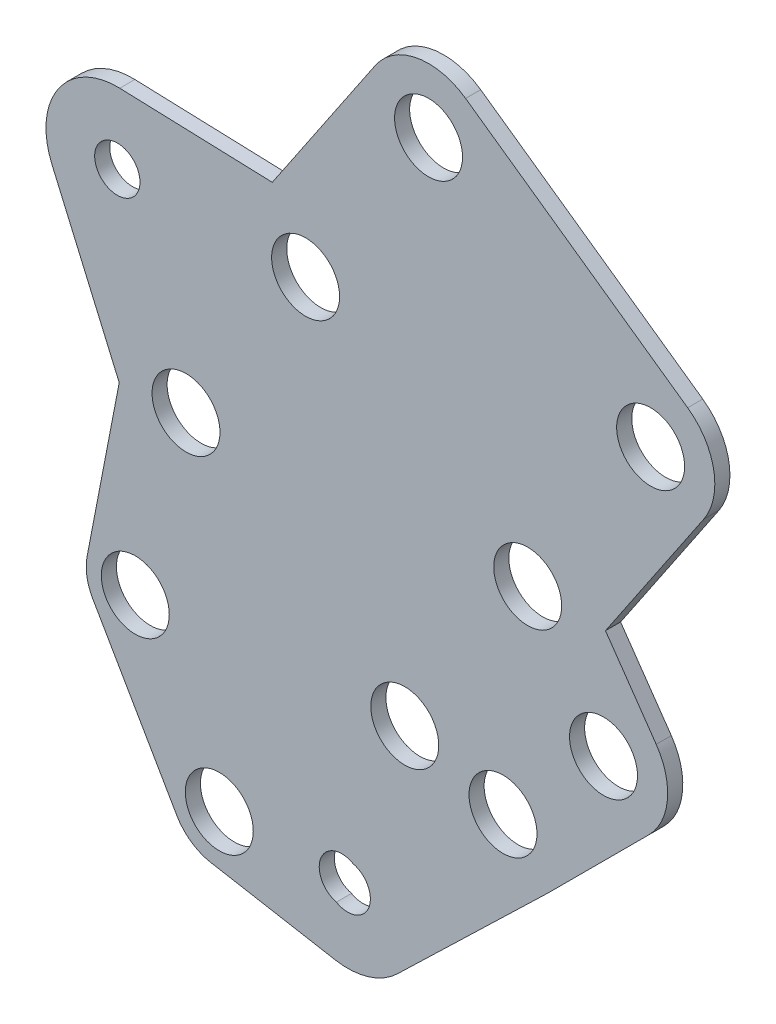
ISO-10303-21;
HEADER;
FILE_DESCRIPTION(('STEP AP214'),'2;1');
FILE_NAME('part.step','',(''),(''),'','','');
FILE_SCHEMA(('AUTOMOTIVE_DESIGN { 1 0 10303 214 1 1 1 1 }'));
ENDSEC;
DATA;
#1=APPLICATION_CONTEXT('core data for automotive mechanical design processes');
#2=APPLICATION_PROTOCOL_DEFINITION('international standard','automotive_design',2000,#1);
#3=PRODUCT_CONTEXT('',#1,'mechanical');
#4=PRODUCT('Part','Part','',(#3));
#5=PRODUCT_RELATED_PRODUCT_CATEGORY('part','',(#4));
#6=PRODUCT_DEFINITION_FORMATION('','',#4);
#7=PRODUCT_DEFINITION_CONTEXT('part definition',#1,'design');
#8=PRODUCT_DEFINITION('design','',#6,#7);
#9=PRODUCT_DEFINITION_SHAPE('','',#8);
#10=(LENGTH_UNIT() NAMED_UNIT(*) SI_UNIT(.MILLI.,.METRE.));
#11=(NAMED_UNIT(*) PLANE_ANGLE_UNIT() SI_UNIT($,.RADIAN.));
#12=(NAMED_UNIT(*) SI_UNIT($,.STERADIAN.) SOLID_ANGLE_UNIT());
#13=UNCERTAINTY_MEASURE_WITH_UNIT(LENGTH_MEASURE(1.E-05),#10,'distance_accuracy_value','');
#14=(GEOMETRIC_REPRESENTATION_CONTEXT(3) GLOBAL_UNCERTAINTY_ASSIGNED_CONTEXT((#13)) GLOBAL_UNIT_ASSIGNED_CONTEXT((#10,
#11,#12)) REPRESENTATION_CONTEXT('',''));
#15=CARTESIAN_POINT('',(0.,0.,0.));
#16=DIRECTION('',(0.,0.,1.));
#17=DIRECTION('',(1.,0.,0.));
#18=AXIS2_PLACEMENT_3D('',#15,#16,#17);
#19=CARTESIAN_POINT('',(137.384321529107,-142.439218373759,3.175));
#20=DIRECTION('',(0.694219925886269,-0.719762943268451,0.));
#21=DIRECTION('',(0.719762943268451,0.694219925886269,0.));
#22=AXIS2_PLACEMENT_3D('',#19,#20,#21);
#23=PLANE('',#22);
#24=DIRECTION('',(-0.719762943268451,-0.694219925886269,0.));
#25=VECTOR('',#24,1.);
#26=CARTESIAN_POINT('',(137.384321529107,-142.439218373759,-3.175));
#27=LINE('',#26,#25);
#28=CARTESIAN_POINT('',(544.742459868336,250.46255470565,-3.175));
#29=VERTEX_POINT('',#28);
#30=CARTESIAN_POINT('',(481.546860125162,189.509646556721,-3.175));
#31=VERTEX_POINT('',#30);
#32=EDGE_CURVE('E269',#29,#31,#27,.T.);
#33=ORIENTED_EDGE('',*,*,#32,.F.);
#34=DIRECTION('',(0.,0.,-1.));
#35=VECTOR('',#34,1.);
#36=CARTESIAN_POINT('',(544.742459868336,250.46255470565,3.175));
#37=LINE('',#36,#35);
#38=CARTESIAN_POINT('',(544.742459868336,250.46255470565,3.175));
#39=VERTEX_POINT('',#38);
#40=EDGE_CURVE('E143',#39,#29,#37,.T.);
#41=ORIENTED_EDGE('',*,*,#40,.F.);
#42=DIRECTION('',(-0.719762943268451,-0.694219925886269,0.));
#43=VECTOR('',#42,1.);
#44=CARTESIAN_POINT('',(137.384321529107,-142.439218373759,3.175));
#45=LINE('',#44,#43);
#46=CARTESIAN_POINT('',(481.546860125162,189.509646556721,3.175));
#47=VERTEX_POINT('',#46);
#48=EDGE_CURVE('E379',#39,#47,#45,.T.);
#49=ORIENTED_EDGE('',*,*,#48,.T.);
#50=DIRECTION('',(0.,0.,-1.));
#51=VECTOR('',#50,1.);
#52=CARTESIAN_POINT('',(481.546860125162,189.509646556721,3.175));
#53=LINE('',#52,#51);
#54=EDGE_CURVE('E138',#47,#31,#53,.T.);
#55=ORIENTED_EDGE('',*,*,#54,.T.);
#56=EDGE_LOOP('',(#33,#41,#49,#55));
#57=FACE_BOUND('',#56,.T.);
#58=ADVANCED_FACE('F47',(#57),#23,.T.);
#59=CARTESIAN_POINT('',(526.007199618481,269.887157137107,3.175));
#60=DIRECTION('',(0.,0.,-1.));
#61=DIRECTION('',(-1.,0.,0.));
#62=AXIS2_PLACEMENT_3D('',#59,#60,#61);
#63=CYLINDRICAL_SURFACE('',#62,26.9874999999999);
#64=CARTESIAN_POINT('',(526.007199618481,269.887157137107,-3.175));
#65=DIRECTION('',(0.,0.,1.));
#66=DIRECTION('',(1.,0.,0.));
#67=AXIS2_PLACEMENT_3D('',#64,#65,#66);
#68=CIRCLE('',#67,26.9874999999999);
#69=CARTESIAN_POINT('',(545.090243875753,250.804112879836,-3.175));
#70=VERTEX_POINT('',#69);
#71=EDGE_CURVE('E273',#29,#70,#68,.T.);
#72=ORIENTED_EDGE('',*,*,#71,.T.);
#73=DIRECTION('',(0.,0.,-1.));
#74=VECTOR('',#73,1.);
#75=CARTESIAN_POINT('',(545.090243875753,250.804112879836,3.175));
#76=LINE('',#75,#74);
#77=CARTESIAN_POINT('',(545.090243875753,250.804112879836,3.175));
#78=VERTEX_POINT('',#77);
#79=EDGE_CURVE('E431',#78,#70,#76,.T.);
#80=ORIENTED_EDGE('',*,*,#79,.F.);
#81=CARTESIAN_POINT('',(526.007199618481,269.887157137107,3.175));
#82=DIRECTION('',(0.,0.,1.));
#83=DIRECTION('',(1.,0.,0.));
#84=AXIS2_PLACEMENT_3D('',#81,#82,#83);
#85=CIRCLE('',#84,26.9874999999999);
#86=EDGE_CURVE('E457',#39,#78,#85,.T.);
#87=ORIENTED_EDGE('',*,*,#86,.F.);
#88=ORIENTED_EDGE('',*,*,#40,.T.);
#89=EDGE_LOOP('',(#72,#80,#87,#88));
#90=FACE_BOUND('',#89,.T.);
#91=ADVANCED_FACE('F522',(#90),#63,.T.);
#92=CARTESIAN_POINT('',(147.143065497958,-147.143065497958,3.175));
#93=DIRECTION('',(0.707106781186547,-0.707106781186548,0.));
#94=DIRECTION('',(0.707106781186548,0.707106781186547,0.));
#95=AXIS2_PLACEMENT_3D('',#92,#93,#94);
#96=PLANE('',#95);
#97=DIRECTION('',(-0.707106781186548,-0.707106781186547,0.));
#98=VECTOR('',#97,1.);
#99=CARTESIAN_POINT('',(147.143065497958,-147.143065497958,-3.175));
#100=LINE('',#99,#98);
#101=CARTESIAN_POINT('',(587.353706575071,293.067575579154,-3.175));
#102=VERTEX_POINT('',#101);
#103=EDGE_CURVE('E278',#102,#70,#100,.T.);
#104=ORIENTED_EDGE('',*,*,#103,.F.);
#105=DIRECTION('',(0.,0.,-1.));
#106=VECTOR('',#105,1.);
#107=CARTESIAN_POINT('',(587.353706575071,293.067575579154,3.175));
#108=LINE('',#107,#106);
#109=CARTESIAN_POINT('',(587.353706575071,293.067575579154,3.175));
#110=VERTEX_POINT('',#109);
#111=EDGE_CURVE('E428',#110,#102,#108,.T.);
#112=ORIENTED_EDGE('',*,*,#111,.F.);
#113=DIRECTION('',(-0.707106781186548,-0.707106781186547,0.));
#114=VECTOR('',#113,1.);
#115=CARTESIAN_POINT('',(147.143065497958,-147.143065497958,3.175));
#116=LINE('',#115,#114);
#117=EDGE_CURVE('E460',#110,#78,#116,.T.);
#118=ORIENTED_EDGE('',*,*,#117,.T.);
#119=ORIENTED_EDGE('',*,*,#79,.T.);
#120=EDGE_LOOP('',(#104,#112,#118,#119));
#121=FACE_BOUND('',#120,.T.);
#122=ADVANCED_FACE('F525',(#121),#96,.T.);
#123=CARTESIAN_POINT('',(568.270662317799,312.150619836426,3.175));
#124=DIRECTION('',(0.,0.,-1.));
#125=DIRECTION('',(-1.,0.,0.));
#126=AXIS2_PLACEMENT_3D('',#123,#124,#125);
#127=CYLINDRICAL_SURFACE('',#126,26.9874999999999);
#128=CARTESIAN_POINT('',(568.270662317799,312.150619836426,-3.175));
#129=DIRECTION('',(0.,0.,1.));
#130=DIRECTION('',(1.,0.,0.));
#131=AXIS2_PLACEMENT_3D('',#128,#129,#130);
#132=CIRCLE('',#131,26.9874999999999);
#133=CARTESIAN_POINT('',(590.436655293727,327.545226412792,-3.175));
#134=VERTEX_POINT('',#133);
#135=EDGE_CURVE('E282',#102,#134,#132,.T.);
#136=ORIENTED_EDGE('',*,*,#135,.T.);
#137=DIRECTION('',(0.,0.,-1.));
#138=VECTOR('',#137,1.);
#139=CARTESIAN_POINT('',(590.436655293727,327.545226412792,3.175));
#140=LINE('',#139,#138);
#141=CARTESIAN_POINT('',(590.436655293727,327.545226412792,3.175));
#142=VERTEX_POINT('',#141);
#143=EDGE_CURVE('E425',#142,#134,#140,.T.);
#144=ORIENTED_EDGE('',*,*,#143,.F.);
#145=CARTESIAN_POINT('',(568.270662317799,312.150619836426,3.175));
#146=DIRECTION('',(0.,0.,1.));
#147=DIRECTION('',(1.,0.,0.));
#148=AXIS2_PLACEMENT_3D('',#145,#146,#147);
#149=CIRCLE('',#148,26.9874999999999);
#150=EDGE_CURVE('E464',#110,#142,#149,.T.);
#151=ORIENTED_EDGE('',*,*,#150,.F.);
#152=ORIENTED_EDGE('',*,*,#111,.T.);
#153=EDGE_LOOP('',(#136,#144,#151,#152));
#154=FACE_BOUND('',#153,.T.);
#155=ADVANCED_FACE('F530',(#154),#127,.T.);
#156=CARTESIAN_POINT('',(551.773392596793,383.214697738056,3.175));
#157=DIRECTION('',(0.821342954179842,0.570434704080256,0.));
#158=DIRECTION('',(-0.570434704080256,0.821342954179842,0.));
#159=AXIS2_PLACEMENT_3D('',#156,#157,#158);
#160=PLANE('',#159);
#161=DIRECTION('',(0.570434704080256,-0.821342954179842,0.));
#162=VECTOR('',#161,1.);
#163=CARTESIAN_POINT('',(551.773392596793,383.214697738056,-3.175));
#164=LINE('',#163,#162);
#165=CARTESIAN_POINT('',(569.102763841685,358.262925220449,-3.175));
#166=VERTEX_POINT('',#165);
#167=EDGE_CURVE('E286',#166,#134,#164,.T.);
#168=ORIENTED_EDGE('',*,*,#167,.F.);
#169=DIRECTION('',(0.,0.,-1.));
#170=VECTOR('',#169,1.);
#171=CARTESIAN_POINT('',(569.102763841685,358.262925220449,3.175));
#172=LINE('',#171,#170);
#173=CARTESIAN_POINT('',(569.102763841685,358.262925220449,3.175));
#174=VERTEX_POINT('',#173);
#175=EDGE_CURVE('E422',#174,#166,#172,.T.);
#176=ORIENTED_EDGE('',*,*,#175,.F.);
#177=DIRECTION('',(0.570434704080256,-0.821342954179842,0.));
#178=VECTOR('',#177,1.);
#179=CARTESIAN_POINT('',(551.773392596793,383.214697738056,3.175));
#180=LINE('',#179,#178);
#181=EDGE_CURVE('E467',#174,#142,#180,.T.);
#182=ORIENTED_EDGE('',*,*,#181,.T.);
#183=ORIENTED_EDGE('',*,*,#143,.T.);
#184=EDGE_LOOP('',(#168,#176,#182,#183));
#185=FACE_BOUND('',#184,.T.);
#186=ADVANCED_FACE('F574',(#185),#160,.T.);
#187=CARTESIAN_POINT('',(225.058405776866,-151.803811483475,3.175));
#188=DIRECTION('',(0.829037572555043,-0.559192903470746,0.));
#189=DIRECTION('',(0.559192903470746,0.829037572555043,0.));
#190=AXIS2_PLACEMENT_3D('',#187,#188,#189);
#191=PLANE('',#190);
#192=DIRECTION('',(-0.559192903470746,-0.829037572555043,0.));
#193=VECTOR('',#192,1.);
#194=CARTESIAN_POINT('',(225.058405776866,-151.803811483475,-3.175));
#195=LINE('',#194,#193);
#196=CARTESIAN_POINT('',(610.463187743842,419.582275338929,-3.175));
#197=VERTEX_POINT('',#196);
#198=EDGE_CURVE('E290',#197,#166,#195,.T.);
#199=ORIENTED_EDGE('',*,*,#198,.F.);
#200=DIRECTION('',(0.,0.,-1.));
#201=VECTOR('',#200,1.);
#202=CARTESIAN_POINT('',(610.463187743842,419.582275338929,3.175));
#203=LINE('',#202,#201);
#204=CARTESIAN_POINT('',(610.463187743842,419.582275338929,3.175));
#205=VERTEX_POINT('',#204);
#206=EDGE_CURVE('E419',#205,#197,#203,.T.);
#207=ORIENTED_EDGE('',*,*,#206,.F.);
#208=DIRECTION('',(-0.559192903470746,-0.829037572555043,0.));
#209=VECTOR('',#208,1.);
#210=CARTESIAN_POINT('',(225.058405776866,-151.803811483475,3.175));
#211=LINE('',#210,#209);
#212=EDGE_CURVE('E471',#205,#174,#211,.T.);
#213=ORIENTED_EDGE('',*,*,#212,.T.);
#214=ORIENTED_EDGE('',*,*,#175,.T.);
#215=EDGE_LOOP('',(#199,#207,#213,#214));
#216=FACE_BOUND('',#215,.T.);
#217=ADVANCED_FACE('F536',(#216),#191,.T.);
#218=CARTESIAN_POINT('',(588.089536254513,434.673493821346,3.175));
#219=DIRECTION('',(0.,0.,-1.));
#220=DIRECTION('',(-1.,0.,0.));
#221=AXIS2_PLACEMENT_3D('',#218,#219,#220);
#222=CYLINDRICAL_SURFACE('',#221,26.9875);
#223=CARTESIAN_POINT('',(588.089536254513,434.673493821346,-3.175));
#224=DIRECTION('',(0.,0.,1.));
#225=DIRECTION('',(1.,0.,0.));
#226=AXIS2_PLACEMENT_3D('',#223,#224,#225);
#227=CIRCLE('',#226,26.9875);
#228=CARTESIAN_POINT('',(603.658514375897,456.717360916433,-3.175));
#229=VERTEX_POINT('',#228);
#230=EDGE_CURVE('E294',#197,#229,#227,.T.);
#231=ORIENTED_EDGE('',*,*,#230,.T.);
#232=DIRECTION('',(0.,0.,-1.));
#233=VECTOR('',#232,1.);
#234=CARTESIAN_POINT('',(603.658514375897,456.717360916433,3.175));
#235=LINE('',#234,#233);
#236=CARTESIAN_POINT('',(603.658514375897,456.717360916433,3.175));
#237=VERTEX_POINT('',#236);
#238=EDGE_CURVE('E415',#237,#229,#235,.T.);
#239=ORIENTED_EDGE('',*,*,#238,.F.);
#240=CARTESIAN_POINT('',(588.089536254513,434.673493821346,3.175));
#241=DIRECTION('',(0.,0.,1.));
#242=DIRECTION('',(1.,0.,0.));
#243=AXIS2_PLACEMENT_3D('',#240,#241,#242);
#244=CIRCLE('',#243,26.9875);
#245=EDGE_CURVE('E475',#205,#237,#244,.T.);
#246=ORIENTED_EDGE('',*,*,#245,.F.);
#247=ORIENTED_EDGE('',*,*,#206,.T.);
#248=EDGE_LOOP('',(#231,#239,#246,#247));
#249=FACE_BOUND('',#248,.T.);
#250=ADVANCED_FACE('F542',(#249),#222,.T.);
#251=CARTESIAN_POINT('',(416.116707441895,589.17299024886,3.175));
#252=DIRECTION('',(-0.576895900746029,-0.81681767837286,0.));
#253=DIRECTION('',(0.81681767837286,-0.576895900746029,0.));
#254=AXIS2_PLACEMENT_3D('',#251,#252,#253);
#255=PLANE('',#254);
#256=DIRECTION('',(-0.81681767837286,0.576895900746029,0.));
#257=VECTOR('',#256,1.);
#258=CARTESIAN_POINT('',(416.116707441895,589.17299024886,-3.175));
#259=LINE('',#258,#257);
#260=CARTESIAN_POINT('',(510.274648356692,522.671821659268,-3.175));
#261=VERTEX_POINT('',#260);
#262=EDGE_CURVE('E297',#229,#261,#259,.T.);
#263=ORIENTED_EDGE('',*,*,#262,.T.);
#264=DIRECTION('',(0.,0.,-1.));
#265=VECTOR('',#264,1.);
#266=CARTESIAN_POINT('',(510.274648356692,522.671821659268,3.175));
#267=LINE('',#266,#265);
#268=CARTESIAN_POINT('',(510.274648356692,522.671821659268,3.175));
#269=VERTEX_POINT('',#268);
#270=EDGE_CURVE('E411',#269,#261,#267,.T.);
#271=ORIENTED_EDGE('',*,*,#270,.F.);
#272=DIRECTION('',(-0.81681767837286,0.576895900746029,0.));
#273=VECTOR('',#272,1.);
#274=CARTESIAN_POINT('',(416.116707441895,589.17299024886,3.175));
#275=LINE('',#274,#273);
#276=EDGE_CURVE('E478',#237,#269,#275,.T.);
#277=ORIENTED_EDGE('',*,*,#276,.F.);
#278=ORIENTED_EDGE('',*,*,#238,.T.);
#279=EDGE_LOOP('',(#263,#271,#277,#278));
#280=FACE_BOUND('',#279,.T.);
#281=ADVANCED_FACE('F549',(#280),#255,.F.);
#282=CARTESIAN_POINT('',(494.705670235308,500.62795456418,3.175));
#283=DIRECTION('',(0.,0.,-1.));
#284=DIRECTION('',(-1.,0.,0.));
#285=AXIS2_PLACEMENT_3D('',#282,#283,#284);
#286=CYLINDRICAL_SURFACE('',#285,26.9875);
#287=CARTESIAN_POINT('',(494.705670235308,500.62795456418,-3.175));
#288=DIRECTION('',(0.,0.,1.));
#289=DIRECTION('',(1.,0.,0.));
#290=AXIS2_PLACEMENT_3D('',#287,#288,#289);
#291=CIRCLE('',#290,26.9875);
#292=CARTESIAN_POINT('',(472.332018745979,515.719173046597,-3.175));
#293=VERTEX_POINT('',#292);
#294=EDGE_CURVE('E300',#261,#293,#291,.T.);
#295=ORIENTED_EDGE('',*,*,#294,.T.);
#296=DIRECTION('',(0.,0.,-1.));
#297=VECTOR('',#296,1.);
#298=CARTESIAN_POINT('',(472.332018745979,515.719173046597,3.175));
#299=LINE('',#298,#297);
#300=CARTESIAN_POINT('',(472.332018745979,515.719173046597,3.175));
#301=VERTEX_POINT('',#300);
#302=EDGE_CURVE('E408',#301,#293,#299,.T.);
#303=ORIENTED_EDGE('',*,*,#302,.F.);
#304=CARTESIAN_POINT('',(494.705670235308,500.62795456418,3.175));
#305=DIRECTION('',(0.,0.,1.));
#306=DIRECTION('',(1.,0.,0.));
#307=AXIS2_PLACEMENT_3D('',#304,#305,#306);
#308=CIRCLE('',#307,26.9875);
#309=EDGE_CURVE('E481',#269,#301,#308,.T.);
#310=ORIENTED_EDGE('',*,*,#309,.F.);
#311=ORIENTED_EDGE('',*,*,#270,.T.);
#312=EDGE_LOOP('',(#295,#303,#310,#311));
#313=FACE_BOUND('',#312,.T.);
#314=ADVANCED_FACE('F553',(#313),#286,.T.);
#315=CARTESIAN_POINT('',(85.5521082551656,-57.7056256519344,3.175));
#316=DIRECTION('',(-0.829037572555042,0.559192903470746,0.));
#317=DIRECTION('',(-0.559192903470746,-0.829037572555042,0.));
#318=AXIS2_PLACEMENT_3D('',#315,#316,#317);
#319=PLANE('',#318);
#320=DIRECTION('',(0.559192903470746,0.829037572555042,0.));
#321=VECTOR('',#320,1.);
#322=CARTESIAN_POINT('',(85.5521082551656,-57.7056256519344,-3.175));
#323=LINE('',#322,#321);
#324=CARTESIAN_POINT('',(429.00168637624,451.479313522538,-3.175));
#325=VERTEX_POINT('',#324);
#326=EDGE_CURVE('E304',#325,#293,#323,.T.);
#327=ORIENTED_EDGE('',*,*,#326,.F.);
#328=DIRECTION('',(0.,0.,-1.));
#329=VECTOR('',#328,1.);
#330=CARTESIAN_POINT('',(429.00168637624,451.479313522538,3.175));
#331=LINE('',#330,#329);
#332=CARTESIAN_POINT('',(429.00168637624,451.479313522538,3.175));
#333=VERTEX_POINT('',#332);
#334=EDGE_CURVE('E405',#333,#325,#331,.T.);
#335=ORIENTED_EDGE('',*,*,#334,.F.);
#336=DIRECTION('',(0.559192903470746,0.829037572555042,0.));
#337=VECTOR('',#336,1.);
#338=CARTESIAN_POINT('',(85.5521082551656,-57.7056256519344,3.175));
#339=LINE('',#338,#337);
#340=EDGE_CURVE('E484',#333,#301,#339,.T.);
#341=ORIENTED_EDGE('',*,*,#340,.T.);
#342=ORIENTED_EDGE('',*,*,#302,.T.);
#343=EDGE_LOOP('',(#327,#335,#341,#342));
#344=FACE_BOUND('',#343,.T.);
#345=ADVANCED_FACE('F556',(#344),#319,.T.);
#346=CARTESIAN_POINT('',(15.9919774317395,465.663049908384,3.175));
#347=DIRECTION('',(0.0343221462531137,0.99941082157268,0.));
#348=DIRECTION('',(-0.99941082157268,0.0343221462531137,0.));
#349=AXIS2_PLACEMENT_3D('',#346,#347,#348);
#350=PLANE('',#349);
#351=DIRECTION('',(0.99941082157268,-0.0343221462531137,0.));
#352=VECTOR('',#351,1.);
#353=CARTESIAN_POINT('',(15.9919774317395,465.663049908384,-3.175));
#354=LINE('',#353,#352);
#355=CARTESIAN_POINT('',(364.876893586184,453.681511526685,-3.175));
#356=VERTEX_POINT('',#355);
#357=EDGE_CURVE('E308',#356,#325,#354,.T.);
#358=ORIENTED_EDGE('',*,*,#357,.F.);
#359=DIRECTION('',(0.,0.,-1.));
#360=VECTOR('',#359,1.);
#361=CARTESIAN_POINT('',(364.876893586184,453.681511526685,3.175));
#362=LINE('',#361,#360);
#363=CARTESIAN_POINT('',(364.876893586184,453.681511526685,3.175));
#364=VERTEX_POINT('',#363);
#365=EDGE_CURVE('E402',#364,#356,#362,.T.);
#366=ORIENTED_EDGE('',*,*,#365,.F.);
#367=DIRECTION('',(0.99941082157268,-0.0343221462531137,0.));
#368=VECTOR('',#367,1.);
#369=CARTESIAN_POINT('',(15.9919774317395,465.663049908384,3.175));
#370=LINE('',#369,#368);
#371=EDGE_CURVE('E488',#364,#333,#370,.T.);
#372=ORIENTED_EDGE('',*,*,#371,.T.);
#373=ORIENTED_EDGE('',*,*,#334,.T.);
#374=EDGE_LOOP('',(#358,#366,#372,#373));
#375=FACE_BOUND('',#374,.T.);
#376=ADVANCED_FACE('F560',(#375),#350,.T.);
#377=CARTESIAN_POINT('',(363.847229200513,423.699186935472,3.175));
#378=DIRECTION('',(0.,0.,-1.));
#379=DIRECTION('',(-1.,0.,0.));
#380=AXIS2_PLACEMENT_3D('',#377,#378,#379);
#381=CYLINDRICAL_SURFACE('',#380,29.9999999440003);
#382=CARTESIAN_POINT('',(363.847229200513,423.699186935472,-3.175));
#383=DIRECTION('',(0.,0.,1.));
#384=DIRECTION('',(1.,0.,0.));
#385=AXIS2_PLACEMENT_3D('',#382,#383,#384);
#386=CIRCLE('',#385,29.9999999440003);
#387=CARTESIAN_POINT('',(336.317579364502,411.777845712828,-3.175));
#388=VERTEX_POINT('',#387);
#389=EDGE_CURVE('E312',#356,#388,#386,.T.);
#390=ORIENTED_EDGE('',*,*,#389,.T.);
#391=DIRECTION('',(0.,0.,-1.));
#392=VECTOR('',#391,1.);
#393=CARTESIAN_POINT('',(336.317579364502,411.777845712828,3.175));
#394=LINE('',#393,#392);
#395=CARTESIAN_POINT('',(336.317579364502,411.777845712828,3.175));
#396=VERTEX_POINT('',#395);
#397=EDGE_CURVE('E398',#396,#388,#394,.T.);
#398=ORIENTED_EDGE('',*,*,#397,.F.);
#399=CARTESIAN_POINT('',(363.847229200513,423.699186935472,3.175));
#400=DIRECTION('',(0.,0.,1.));
#401=DIRECTION('',(1.,0.,0.));
#402=AXIS2_PLACEMENT_3D('',#399,#400,#401);
#403=CIRCLE('',#402,29.9999999440003);
#404=EDGE_CURVE('E492',#364,#396,#403,.T.);
#405=ORIENTED_EDGE('',*,*,#404,.F.);
#406=ORIENTED_EDGE('',*,*,#365,.T.);
#407=EDGE_LOOP('',(#390,#398,#405,#406));
#408=FACE_BOUND('',#407,.T.);
#409=ADVANCED_FACE('F565',(#408),#381,.T.);
#410=CARTESIAN_POINT('',(433.367142716454,187.663759393227,3.175));
#411=DIRECTION('',(0.917654996246613,0.397378041496543,0.));
#412=DIRECTION('',(-0.397378041496543,0.917654996246613,0.));
#413=AXIS2_PLACEMENT_3D('',#410,#411,#412);
#414=PLANE('',#413);
#415=DIRECTION('',(0.397378041496543,-0.917654996246613,0.));
#416=VECTOR('',#415,1.);
#417=CARTESIAN_POINT('',(433.367142716454,187.663759393227,-3.175));
#418=LINE('',#417,#416);
#419=CARTESIAN_POINT('',(364.646132527292,346.359438977595,-3.175));
#420=VERTEX_POINT('',#419);
#421=EDGE_CURVE('E315',#388,#420,#418,.T.);
#422=ORIENTED_EDGE('',*,*,#421,.T.);
#423=DIRECTION('',(0.,0.,-1.));
#424=VECTOR('',#423,1.);
#425=CARTESIAN_POINT('',(364.646132527292,346.359438977595,3.175));
#426=LINE('',#425,#424);
#427=CARTESIAN_POINT('',(364.646132527292,346.359438977595,3.175));
#428=VERTEX_POINT('',#427);
#429=EDGE_CURVE('E394',#428,#420,#426,.T.);
#430=ORIENTED_EDGE('',*,*,#429,.F.);
#431=DIRECTION('',(0.397378041496543,-0.917654996246613,0.));
#432=VECTOR('',#431,1.);
#433=CARTESIAN_POINT('',(433.367142716454,187.663759393227,3.175));
#434=LINE('',#433,#432);
#435=EDGE_CURVE('E495',#396,#428,#434,.T.);
#436=ORIENTED_EDGE('',*,*,#435,.F.);
#437=ORIENTED_EDGE('',*,*,#397,.T.);
#438=EDGE_LOOP('',(#422,#430,#436,#437));
#439=FACE_BOUND('',#438,.T.);
#440=ADVANCED_FACE('F569',(#439),#414,.F.);
#441=CARTESIAN_POINT('',(287.160921652011,-55.3852380431147,3.175));
#442=DIRECTION('',(0.981903585121092,-0.189381492037493,0.));
#443=DIRECTION('',(0.189381492037493,0.981903585121092,0.));
#444=AXIS2_PLACEMENT_3D('',#441,#442,#443);
#445=PLANE('',#444);
#446=DIRECTION('',(-0.189381492037493,-0.981903585121092,0.));
#447=VECTOR('',#446,1.);
#448=CARTESIAN_POINT('',(287.160921652011,-55.3852380431147,-3.175));
#449=LINE('',#448,#447);
#450=CARTESIAN_POINT('',(351.134209014627,276.302930307039,-3.175));
#451=VERTEX_POINT('',#450);
#452=EDGE_CURVE('E318',#420,#451,#449,.T.);
#453=ORIENTED_EDGE('',*,*,#452,.T.);
#454=DIRECTION('',(0.,0.,-1.));
#455=VECTOR('',#454,1.);
#456=CARTESIAN_POINT('',(351.134209014627,276.302930307039,3.175));
#457=LINE('',#456,#455);
#458=CARTESIAN_POINT('',(351.134209014627,276.302930307039,3.175));
#459=VERTEX_POINT('',#458);
#460=EDGE_CURVE('E390',#459,#451,#457,.T.);
#461=ORIENTED_EDGE('',*,*,#460,.F.);
#462=DIRECTION('',(-0.189381492037493,-0.981903585121092,0.));
#463=VECTOR('',#462,1.);
#464=CARTESIAN_POINT('',(287.160921652011,-55.3852380431147,3.175));
#465=LINE('',#464,#463);
#466=EDGE_CURVE('E498',#428,#459,#465,.T.);
#467=ORIENTED_EDGE('',*,*,#466,.F.);
#468=ORIENTED_EDGE('',*,*,#429,.T.);
#469=EDGE_LOOP('',(#453,#461,#467,#468));
#470=FACE_BOUND('',#469,.T.);
#471=ADVANCED_FACE('F573',(#470),#445,.F.);
#472=CARTESIAN_POINT('',(371.398244252564,272.394569765116,3.175));
#473=DIRECTION('',(0.,0.,-1.));
#474=DIRECTION('',(-1.,0.,0.));
#475=AXIS2_PLACEMENT_3D('',#472,#473,#474);
#476=CYLINDRICAL_SURFACE('',#475,20.6375);
#477=CARTESIAN_POINT('',(371.398244252564,272.394569765116,-3.175));
#478=DIRECTION('',(0.,0.,1.));
#479=DIRECTION('',(1.,0.,0.));
#480=AXIS2_PLACEMENT_3D('',#477,#478,#479);
#481=CIRCLE('',#480,20.6375);
#482=CARTESIAN_POINT('',(353.524270545582,262.078200724986,-3.175));
#483=VERTEX_POINT('',#482);
#484=EDGE_CURVE('E321',#451,#483,#481,.T.);
#485=ORIENTED_EDGE('',*,*,#484,.T.);
#486=DIRECTION('',(0.,0.,-1.));
#487=VECTOR('',#486,1.);
#488=CARTESIAN_POINT('',(353.524270545582,262.078200724986,3.175));
#489=LINE('',#488,#487);
#490=CARTESIAN_POINT('',(353.524270545582,262.078200724986,3.175));
#491=VERTEX_POINT('',#490);
#492=EDGE_CURVE('E386',#491,#483,#489,.T.);
#493=ORIENTED_EDGE('',*,*,#492,.F.);
#494=CARTESIAN_POINT('',(371.398244252564,272.394569765116,3.175));
#495=DIRECTION('',(0.,0.,1.));
#496=DIRECTION('',(1.,0.,0.));
#497=AXIS2_PLACEMENT_3D('',#494,#495,#496);
#498=CIRCLE('',#497,20.6375);
#499=EDGE_CURVE('E501',#459,#491,#498,.T.);
#500=ORIENTED_EDGE('',*,*,#499,.F.);
#501=ORIENTED_EDGE('',*,*,#460,.T.);
#502=EDGE_LOOP('',(#485,#493,#500,#501));
#503=FACE_BOUND('',#502,.T.);
#504=ADVANCED_FACE('F509',(#503),#476,.T.);
#505=CARTESIAN_POINT('',(378.64971411729,218.546264630994,3.175));
#506=DIRECTION('',(0.866092002761063,0.499884629442966,0.));
#507=DIRECTION('',(-0.499884629442966,0.866092002761063,0.));
#508=AXIS2_PLACEMENT_3D('',#505,#506,#507);
#509=PLANE('',#508);
#510=DIRECTION('',(0.499884629442966,-0.866092002761063,0.));
#511=VECTOR('',#510,1.);
#512=CARTESIAN_POINT('',(378.64971411729,218.546264630994,-3.175));
#513=LINE('',#512,#511);
#514=CARTESIAN_POINT('',(388.843526293018,200.884630959871,-3.175));
#515=VERTEX_POINT('',#514);
#516=EDGE_CURVE('E324',#483,#515,#513,.T.);
#517=ORIENTED_EDGE('',*,*,#516,.T.);
#518=DIRECTION('',(0.,0.,-1.));
#519=VECTOR('',#518,1.);
#520=CARTESIAN_POINT('',(388.843526293018,200.884630959871,3.175));
#521=LINE('',#520,#519);
#522=CARTESIAN_POINT('',(388.843526293018,200.884630959871,3.175));
#523=VERTEX_POINT('',#522);
#524=EDGE_CURVE('E215',#523,#515,#521,.T.);
#525=ORIENTED_EDGE('',*,*,#524,.F.);
#526=DIRECTION('',(0.499884629442966,-0.866092002761063,0.));
#527=VECTOR('',#526,1.);
#528=CARTESIAN_POINT('',(378.64971411729,218.546264630994,3.175));
#529=LINE('',#528,#527);
#530=EDGE_CURVE('E200',#491,#523,#529,.T.);
#531=ORIENTED_EDGE('',*,*,#530,.F.);
#532=ORIENTED_EDGE('',*,*,#492,.T.);
#533=EDGE_LOOP('',(#517,#525,#531,#532));
#534=FACE_BOUND('',#533,.T.);
#535=ADVANCED_FACE('F513',(#534),#509,.F.);
#536=CARTESIAN_POINT('',(406.7175,211.201,3.175));
#537=DIRECTION('',(0.,0.,-1.));
#538=DIRECTION('',(-1.,0.,0.));
#539=AXIS2_PLACEMENT_3D('',#536,#537,#538);
#540=CYLINDRICAL_SURFACE('',#539,20.6375);
#541=CARTESIAN_POINT('',(406.7175,211.201,-3.175));
#542=DIRECTION('',(0.,0.,1.));
#543=DIRECTION('',(1.,0.,0.));
#544=AXIS2_PLACEMENT_3D('',#541,#542,#543);
#545=CIRCLE('',#544,20.6375);
#546=CARTESIAN_POINT('',(403.102513633132,190.882577821657,-3.175));
#547=VERTEX_POINT('',#546);
#548=EDGE_CURVE('E210',#515,#547,#545,.T.);
#549=ORIENTED_EDGE('',*,*,#548,.T.);
#550=DIRECTION('',(0.,0.,-1.));
#551=VECTOR('',#550,1.);
#552=CARTESIAN_POINT('',(403.102513633132,190.882577821657,3.175));
#553=LINE('',#552,#551);
#554=CARTESIAN_POINT('',(403.102513633132,190.882577821657,3.175));
#555=VERTEX_POINT('',#554);
#556=EDGE_CURVE('E207',#555,#547,#553,.T.);
#557=ORIENTED_EDGE('',*,*,#556,.F.);
#558=CARTESIAN_POINT('',(406.7175,211.201,3.175));
#559=DIRECTION('',(0.,0.,1.));
#560=DIRECTION('',(1.,0.,0.));
#561=AXIS2_PLACEMENT_3D('',#558,#559,#560);
#562=CIRCLE('',#561,20.6375);
#563=EDGE_CURVE('E193',#523,#555,#562,.T.);
#564=ORIENTED_EDGE('',*,*,#563,.F.);
#565=ORIENTED_EDGE('',*,*,#524,.T.);
#566=EDGE_LOOP('',(#549,#557,#564,#565));
#567=FACE_BOUND('',#566,.T.);
#568=ADVANCED_FACE('F208',(#567),#540,.T.);
#569=CARTESIAN_POINT('',(45.2875937926538,254.543823056727,3.175));
#570=DIRECTION('',(-0.175165905117751,-0.984538930507209,0.));
#571=DIRECTION('',(0.984538930507209,-0.175165905117751,0.));
#572=AXIS2_PLACEMENT_3D('',#569,#570,#571);
#573=PLANE('',#572);
#574=DIRECTION('',(-0.984538930507209,0.175165905117751,0.));
#575=VECTOR('',#574,1.);
#576=CARTESIAN_POINT('',(45.2875937926538,254.543823056727,-3.175));
#577=LINE('',#576,#575);
#578=CARTESIAN_POINT('',(455.465285243726,181.566366954385,-3.175));
#579=VERTEX_POINT('',#578);
#580=EDGE_CURVE('E329',#579,#547,#577,.T.);
#581=ORIENTED_EDGE('',*,*,#580,.F.);
#582=DIRECTION('',(0.,0.,-1.));
#583=VECTOR('',#582,1.);
#584=CARTESIAN_POINT('',(455.465285243726,181.566366954385,3.175));
#585=LINE('',#584,#583);
#586=CARTESIAN_POINT('',(455.465285243726,181.566366954385,3.175));
#587=VERTEX_POINT('',#586);
#588=EDGE_CURVE('E216',#587,#579,#585,.T.);
#589=ORIENTED_EDGE('',*,*,#588,.F.);
#590=DIRECTION('',(-0.984538930507209,0.175165905117751,0.));
#591=VECTOR('',#590,1.);
#592=CARTESIAN_POINT('',(45.2875937926538,254.543823056727,3.175));
#593=LINE('',#592,#591);
#594=EDGE_CURVE('E198',#587,#555,#593,.T.);
#595=ORIENTED_EDGE('',*,*,#594,.T.);
#596=ORIENTED_EDGE('',*,*,#556,.T.);
#597=EDGE_LOOP('',(#581,#589,#595,#596));
#598=FACE_BOUND('',#597,.T.);
#599=ADVANCED_FACE('F218',(#598),#573,.T.);
#600=CARTESIAN_POINT('',(406.7175,211.201,3.175));
#601=DIRECTION('',(0.,0.,-1.));
#602=DIRECTION('',(-1.,0.,0.));
#603=AXIS2_PLACEMENT_3D('',#600,#601,#602);
#604=CYLINDRICAL_SURFACE('',#603,14.2875);
#605=CARTESIAN_POINT('',(406.7175,211.201,3.175));
#606=DIRECTION('',(0.,0.,1.));
#607=DIRECTION('',(1.,0.,0.));
#608=AXIS2_PLACEMENT_3D('',#605,#606,#607);
#609=CIRCLE('',#608,14.2875);
#610=CARTESIAN_POINT('',(421.005,211.201,3.175));
#611=VERTEX_POINT('',#610);
#612=EDGE_CURVE('E261',#611,#611,#609,.T.);
#613=ORIENTED_EDGE('',*,*,#612,.T.);
#614=EDGE_LOOP('',(#613));
#615=FACE_BOUND('',#614,.T.);
#616=CARTESIAN_POINT('',(406.7175,211.201,-3.175));
#617=DIRECTION('',(0.,0.,1.));
#618=DIRECTION('',(1.,0.,0.));
#619=AXIS2_PLACEMENT_3D('',#616,#617,#618);
#620=CIRCLE('',#619,14.2875);
#621=CARTESIAN_POINT('',(421.005,211.201,-3.175));
#622=VERTEX_POINT('',#621);
#623=EDGE_CURVE('E371',#622,#622,#620,.T.);
#624=ORIENTED_EDGE('',*,*,#623,.F.);
#625=EDGE_LOOP('',(#624));
#626=FACE_BOUND('',#625,.T.);
#627=ADVANCED_FACE('F706',(#615,#626),#604,.F.);
#628=CARTESIAN_POINT('',(484.709868556039,281.40683355377,3.175));
#629=DIRECTION('',(0.,0.,-1.));
#630=DIRECTION('',(-1.,0.,0.));
#631=AXIS2_PLACEMENT_3D('',#628,#629,#630);
#632=CYLINDRICAL_SURFACE('',#631,14.2875);
#633=CARTESIAN_POINT('',(484.709868556039,281.40683355377,3.175));
#634=DIRECTION('',(0.,0.,1.));
#635=DIRECTION('',(1.,0.,0.));
#636=AXIS2_PLACEMENT_3D('',#633,#634,#635);
#637=CIRCLE('',#636,14.2875);
#638=CARTESIAN_POINT('',(498.997368556039,281.40683355377,3.175));
#639=VERTEX_POINT('',#638);
#640=EDGE_CURVE('E257',#639,#639,#637,.T.);
#641=ORIENTED_EDGE('',*,*,#640,.T.);
#642=EDGE_LOOP('',(#641));
#643=FACE_BOUND('',#642,.T.);
#644=CARTESIAN_POINT('',(484.709868556039,281.40683355377,-3.175));
#645=DIRECTION('',(0.,0.,1.));
#646=DIRECTION('',(1.,0.,0.));
#647=AXIS2_PLACEMENT_3D('',#644,#645,#646);
#648=CIRCLE('',#647,14.2875);
#649=CARTESIAN_POINT('',(498.997368556039,281.40683355377,-3.175));
#650=VERTEX_POINT('',#649);
#651=EDGE_CURVE('E367',#650,#650,#648,.T.);
#652=ORIENTED_EDGE('',*,*,#651,.F.);
#653=EDGE_LOOP('',(#652));
#654=FACE_BOUND('',#653,.T.);
#655=ADVANCED_FACE('F715',(#643,#654),#632,.F.);
#656=CARTESIAN_POINT('',(526.007199618481,269.887157137107,3.175));
#657=DIRECTION('',(0.,0.,-1.));
#658=DIRECTION('',(-1.,0.,0.));
#659=AXIS2_PLACEMENT_3D('',#656,#657,#658);
#660=CYLINDRICAL_SURFACE('',#659,14.2875);
#661=CARTESIAN_POINT('',(526.007199618481,269.887157137107,3.175));
#662=DIRECTION('',(0.,0.,1.));
#663=DIRECTION('',(1.,0.,0.));
#664=AXIS2_PLACEMENT_3D('',#661,#662,#663);
#665=CIRCLE('',#664,14.2875);
#666=CARTESIAN_POINT('',(540.294699618481,269.887157137107,3.175));
#667=VERTEX_POINT('',#666);
#668=EDGE_CURVE('E253',#667,#667,#665,.T.);
#669=ORIENTED_EDGE('',*,*,#668,.T.);
#670=EDGE_LOOP('',(#669));
#671=FACE_BOUND('',#670,.T.);
#672=CARTESIAN_POINT('',(526.007199618481,269.887157137107,-3.175));
#673=DIRECTION('',(0.,0.,1.));
#674=DIRECTION('',(1.,0.,0.));
#675=AXIS2_PLACEMENT_3D('',#672,#673,#674);
#676=CIRCLE('',#675,14.2875);
#677=CARTESIAN_POINT('',(540.294699618481,269.887157137107,-3.175));
#678=VERTEX_POINT('',#677);
#679=EDGE_CURVE('E363',#678,#678,#676,.T.);
#680=ORIENTED_EDGE('',*,*,#679,.F.);
#681=EDGE_LOOP('',(#680));
#682=FACE_BOUND('',#681,.T.);
#683=ADVANCED_FACE('F725',(#671,#682),#660,.F.);
#684=CARTESIAN_POINT('',(568.270662317799,312.150619836426,3.175));
#685=DIRECTION('',(0.,0.,-1.));
#686=DIRECTION('',(-1.,0.,0.));
#687=AXIS2_PLACEMENT_3D('',#684,#685,#686);
#688=CYLINDRICAL_SURFACE('',#687,14.2875);
#689=CARTESIAN_POINT('',(568.270662317799,312.150619836426,3.175));
#690=DIRECTION('',(0.,0.,1.));
#691=DIRECTION('',(1.,0.,0.));
#692=AXIS2_PLACEMENT_3D('',#689,#690,#691);
#693=CIRCLE('',#692,14.2875);
#694=CARTESIAN_POINT('',(582.558162317799,312.150619836426,3.175));
#695=VERTEX_POINT('',#694);
#696=EDGE_CURVE('E249',#695,#695,#693,.T.);
#697=ORIENTED_EDGE('',*,*,#696,.T.);
#698=EDGE_LOOP('',(#697));
#699=FACE_BOUND('',#698,.T.);
#700=CARTESIAN_POINT('',(568.270662317799,312.150619836426,-3.175));
#701=DIRECTION('',(0.,0.,1.));
#702=DIRECTION('',(1.,0.,0.));
#703=AXIS2_PLACEMENT_3D('',#700,#701,#702);
#704=CIRCLE('',#703,14.2875);
#705=CARTESIAN_POINT('',(582.558162317799,312.150619836426,-3.175));
#706=VERTEX_POINT('',#705);
#707=EDGE_CURVE('E359',#706,#706,#704,.T.);
#708=ORIENTED_EDGE('',*,*,#707,.F.);
#709=EDGE_LOOP('',(#708));
#710=FACE_BOUND('',#709,.T.);
#711=ADVANCED_FACE('F735',(#699,#710),#688,.F.);
#712=CARTESIAN_POINT('',(536.399702405276,358.040163687558,3.175));
#713=DIRECTION('',(0.,0.,-1.));
#714=DIRECTION('',(-1.,0.,0.));
#715=AXIS2_PLACEMENT_3D('',#712,#713,#714);
#716=CYLINDRICAL_SURFACE('',#715,14.2875);
#717=CARTESIAN_POINT('',(536.399702405276,358.040163687558,3.175));
#718=DIRECTION('',(0.,0.,1.));
#719=DIRECTION('',(1.,0.,0.));
#720=AXIS2_PLACEMENT_3D('',#717,#718,#719);
#721=CIRCLE('',#720,14.2875);
#722=CARTESIAN_POINT('',(550.687202405276,358.040163687558,3.175));
#723=VERTEX_POINT('',#722);
#724=EDGE_CURVE('E245',#723,#723,#721,.T.);
#725=ORIENTED_EDGE('',*,*,#724,.T.);
#726=EDGE_LOOP('',(#725));
#727=FACE_BOUND('',#726,.T.);
#728=CARTESIAN_POINT('',(536.399702405276,358.040163687558,-3.175));
#729=DIRECTION('',(0.,0.,1.));
#730=DIRECTION('',(1.,0.,0.));
#731=AXIS2_PLACEMENT_3D('',#728,#729,#730);
#732=CIRCLE('',#731,14.2875);
#733=CARTESIAN_POINT('',(550.687202405276,358.040163687558,-3.175));
#734=VERTEX_POINT('',#733);
#735=EDGE_CURVE('E355',#734,#734,#732,.T.);
#736=ORIENTED_EDGE('',*,*,#735,.F.);
#737=EDGE_LOOP('',(#736));
#738=FACE_BOUND('',#737,.T.);
#739=ADVANCED_FACE('F745',(#727,#738),#716,.F.);
#740=CARTESIAN_POINT('',(588.089536254513,434.673493821346,3.175));
#741=DIRECTION('',(0.,0.,-1.));
#742=DIRECTION('',(-1.,0.,0.));
#743=AXIS2_PLACEMENT_3D('',#740,#741,#742);
#744=CYLINDRICAL_SURFACE('',#743,14.2875);
#745=CARTESIAN_POINT('',(588.089536254513,434.673493821346,3.175));
#746=DIRECTION('',(0.,0.,1.));
#747=DIRECTION('',(1.,0.,0.));
#748=AXIS2_PLACEMENT_3D('',#745,#746,#747);
#749=CIRCLE('',#748,14.2875);
#750=CARTESIAN_POINT('',(602.377036254513,434.673493821346,3.175));
#751=VERTEX_POINT('',#750);
#752=EDGE_CURVE('E241',#751,#751,#749,.T.);
#753=ORIENTED_EDGE('',*,*,#752,.T.);
#754=EDGE_LOOP('',(#753));
#755=FACE_BOUND('',#754,.T.);
#756=CARTESIAN_POINT('',(588.089536254513,434.673493821346,-3.175));
#757=DIRECTION('',(0.,0.,1.));
#758=DIRECTION('',(1.,0.,0.));
#759=AXIS2_PLACEMENT_3D('',#756,#757,#758);
#760=CIRCLE('',#759,14.2875);
#761=CARTESIAN_POINT('',(602.377036254513,434.673493821346,-3.175));
#762=VERTEX_POINT('',#761);
#763=EDGE_CURVE('E351',#762,#762,#760,.T.);
#764=ORIENTED_EDGE('',*,*,#763,.F.);
#765=EDGE_LOOP('',(#764));
#766=FACE_BOUND('',#765,.T.);
#767=ADVANCED_FACE('F755',(#755,#766),#744,.F.);
#768=CARTESIAN_POINT('',(494.705670235308,500.62795456418,3.175));
#769=DIRECTION('',(0.,0.,-1.));
#770=DIRECTION('',(-1.,0.,0.));
#771=AXIS2_PLACEMENT_3D('',#768,#769,#770);
#772=CYLINDRICAL_SURFACE('',#771,14.2875000000001);
#773=CARTESIAN_POINT('',(494.705670235308,500.62795456418,3.175));
#774=DIRECTION('',(0.,0.,1.));
#775=DIRECTION('',(1.,0.,0.));
#776=AXIS2_PLACEMENT_3D('',#773,#774,#775);
#777=CIRCLE('',#776,14.2875000000001);
#778=CARTESIAN_POINT('',(508.993170235308,500.62795456418,3.175));
#779=VERTEX_POINT('',#778);
#780=EDGE_CURVE('E237',#779,#779,#777,.T.);
#781=ORIENTED_EDGE('',*,*,#780,.T.);
#782=EDGE_LOOP('',(#781));
#783=FACE_BOUND('',#782,.T.);
#784=CARTESIAN_POINT('',(494.705670235308,500.62795456418,-3.175));
#785=DIRECTION('',(0.,0.,1.));
#786=DIRECTION('',(1.,0.,0.));
#787=AXIS2_PLACEMENT_3D('',#784,#785,#786);
#788=CIRCLE('',#787,14.2875000000001);
#789=CARTESIAN_POINT('',(508.993170235308,500.62795456418,-3.175));
#790=VERTEX_POINT('',#789);
#791=EDGE_CURVE('E347',#790,#790,#788,.T.);
#792=ORIENTED_EDGE('',*,*,#791,.F.);
#793=EDGE_LOOP('',(#792));
#794=FACE_BOUND('',#793,.T.);
#795=ADVANCED_FACE('F765',(#783,#794),#772,.F.);
#796=CARTESIAN_POINT('',(443.015836386071,423.994624430393,3.175));
#797=DIRECTION('',(0.,0.,-1.));
#798=DIRECTION('',(-1.,0.,0.));
#799=AXIS2_PLACEMENT_3D('',#796,#797,#798);
#800=CYLINDRICAL_SURFACE('',#799,14.2875);
#801=CARTESIAN_POINT('',(443.015836386071,423.994624430393,3.175));
#802=DIRECTION('',(0.,0.,1.));
#803=DIRECTION('',(1.,0.,0.));
#804=AXIS2_PLACEMENT_3D('',#801,#802,#803);
#805=CIRCLE('',#804,14.2875);
#806=CARTESIAN_POINT('',(457.303336386071,423.994624430393,3.175));
#807=VERTEX_POINT('',#806);
#808=EDGE_CURVE('E233',#807,#807,#805,.T.);
#809=ORIENTED_EDGE('',*,*,#808,.T.);
#810=EDGE_LOOP('',(#809));
#811=FACE_BOUND('',#810,.T.);
#812=CARTESIAN_POINT('',(443.015836386071,423.994624430393,-3.175));
#813=DIRECTION('',(0.,0.,1.));
#814=DIRECTION('',(1.,0.,0.));
#815=AXIS2_PLACEMENT_3D('',#812,#813,#814);
#816=CIRCLE('',#815,14.2875);
#817=CARTESIAN_POINT('',(457.303336386071,423.994624430393,-3.175));
#818=VERTEX_POINT('',#817);
#819=EDGE_CURVE('E343',#818,#818,#816,.T.);
#820=ORIENTED_EDGE('',*,*,#819,.F.);
#821=EDGE_LOOP('',(#820));
#822=FACE_BOUND('',#821,.T.);
#823=ADVANCED_FACE('F775',(#811,#822),#800,.F.);
#824=CARTESIAN_POINT('',(392.723984769224,349.433888189021,3.175));
#825=DIRECTION('',(0.,0.,-1.));
#826=DIRECTION('',(-1.,0.,0.));
#827=AXIS2_PLACEMENT_3D('',#824,#825,#826);
#828=CYLINDRICAL_SURFACE('',#827,14.2875);
#829=CARTESIAN_POINT('',(392.723984769224,349.433888189021,3.175));
#830=DIRECTION('',(0.,0.,1.));
#831=DIRECTION('',(1.,0.,0.));
#832=AXIS2_PLACEMENT_3D('',#829,#830,#831);
#833=CIRCLE('',#832,14.2875);
#834=CARTESIAN_POINT('',(407.011484769224,349.433888189021,3.175));
#835=VERTEX_POINT('',#834);
#836=EDGE_CURVE('E229',#835,#835,#833,.T.);
#837=ORIENTED_EDGE('',*,*,#836,.T.);
#838=EDGE_LOOP('',(#837));
#839=FACE_BOUND('',#838,.T.);
#840=CARTESIAN_POINT('',(392.723984769224,349.433888189021,-3.175));
#841=DIRECTION('',(0.,0.,1.));
#842=DIRECTION('',(1.,0.,0.));
#843=AXIS2_PLACEMENT_3D('',#840,#841,#842);
#844=CIRCLE('',#843,14.2875);
#845=CARTESIAN_POINT('',(407.011484769224,349.433888189021,-3.175));
#846=VERTEX_POINT('',#845);
#847=EDGE_CURVE('E339',#846,#846,#844,.T.);
#848=ORIENTED_EDGE('',*,*,#847,.F.);
#849=EDGE_LOOP('',(#848));
#850=FACE_BOUND('',#849,.T.);
#851=ADVANCED_FACE('F785',(#839,#850),#828,.F.);
#852=CARTESIAN_POINT('',(363.847229200513,423.699186935472,3.175));
#853=DIRECTION('',(0.,0.,-1.));
#854=DIRECTION('',(-1.,0.,0.));
#855=AXIS2_PLACEMENT_3D('',#852,#853,#854);
#856=CYLINDRICAL_SURFACE('',#855,9.52500000000002);
#857=CARTESIAN_POINT('',(363.847229200513,423.699186935472,3.175));
#858=DIRECTION('',(0.,0.,1.));
#859=DIRECTION('',(1.,0.,0.));
#860=AXIS2_PLACEMENT_3D('',#857,#858,#859);
#861=CIRCLE('',#860,9.52500000000002);
#862=CARTESIAN_POINT('',(373.372229200513,423.699186935472,3.175));
#863=VERTEX_POINT('',#862);
#864=EDGE_CURVE('E222',#863,#863,#861,.T.);
#865=ORIENTED_EDGE('',*,*,#864,.T.);
#866=EDGE_LOOP('',(#865));
#867=FACE_BOUND('',#866,.T.);
#868=CARTESIAN_POINT('',(363.847229200513,423.699186935472,-3.175));
#869=DIRECTION('',(0.,0.,1.));
#870=DIRECTION('',(1.,0.,0.));
#871=AXIS2_PLACEMENT_3D('',#868,#869,#870);
#872=CIRCLE('',#871,9.52500000000002);
#873=CARTESIAN_POINT('',(373.372229200513,423.699186935472,-3.175));
#874=VERTEX_POINT('',#873);
#875=EDGE_CURVE('E335',#874,#874,#872,.T.);
#876=ORIENTED_EDGE('',*,*,#875,.F.);
#877=EDGE_LOOP('',(#876));
#878=FACE_BOUND('',#877,.T.);
#879=ADVANCED_FACE('F795',(#867,#878),#856,.F.);
#880=CARTESIAN_POINT('',(460.72026238745,211.102534814468,3.175));
#881=DIRECTION('',(0.,0.,-1.));
#882=DIRECTION('',(-1.,0.,0.));
#883=AXIS2_PLACEMENT_3D('',#880,#881,#882);
#884=CYLINDRICAL_SURFACE('',#883,29.9999999440004);
#885=CARTESIAN_POINT('',(460.72026238745,211.102534814468,-3.175));
#886=DIRECTION('',(0.,0.,1.));
#887=DIRECTION('',(1.,0.,0.));
#888=AXIS2_PLACEMENT_3D('',#885,#886,#887);
#889=CIRCLE('',#888,29.9999999440004);
#890=EDGE_CURVE('E332',#579,#31,#889,.T.);
#891=ORIENTED_EDGE('',*,*,#890,.T.);
#892=ORIENTED_EDGE('',*,*,#54,.F.);
#893=CARTESIAN_POINT('',(460.72026238745,211.102534814468,3.175));
#894=DIRECTION('',(0.,0.,1.));
#895=DIRECTION('',(1.,0.,0.));
#896=AXIS2_PLACEMENT_3D('',#893,#894,#895);
#897=CIRCLE('',#896,29.9999999440004);
#898=EDGE_CURVE('E71',#587,#47,#897,.T.);
#899=ORIENTED_EDGE('',*,*,#898,.F.);
#900=ORIENTED_EDGE('',*,*,#588,.T.);
#901=EDGE_LOOP('',(#891,#892,#899,#900));
#902=FACE_BOUND('',#901,.T.);
#903=ADVANCED_FACE('F518',(#902),#884,.T.);
#904=CARTESIAN_POINT('',(371.398244252564,272.394569765116,3.175));
#905=DIRECTION('',(0.,0.,-1.));
#906=DIRECTION('',(-1.,0.,0.));
#907=AXIS2_PLACEMENT_3D('',#904,#905,#906);
#908=CYLINDRICAL_SURFACE('',#907,14.2875);
#909=CARTESIAN_POINT('',(371.398244252564,272.394569765116,3.175));
#910=DIRECTION('',(0.,0.,1.));
#911=DIRECTION('',(1.,0.,0.));
#912=AXIS2_PLACEMENT_3D('',#909,#910,#911);
#913=CIRCLE('',#912,14.2875);
#914=CARTESIAN_POINT('',(385.685744252564,272.394569765116,3.175));
#915=VERTEX_POINT('',#914);
#916=EDGE_CURVE('E265',#915,#915,#913,.T.);
#917=ORIENTED_EDGE('',*,*,#916,.T.);
#918=EDGE_LOOP('',(#917));
#919=FACE_BOUND('',#918,.T.);
#920=CARTESIAN_POINT('',(371.398244252564,272.394569765116,-3.175));
#921=DIRECTION('',(0.,0.,1.));
#922=DIRECTION('',(1.,0.,0.));
#923=AXIS2_PLACEMENT_3D('',#920,#921,#922);
#924=CIRCLE('',#923,14.2875);
#925=CARTESIAN_POINT('',(385.685744252564,272.394569765116,-3.175));
#926=VERTEX_POINT('',#925);
#927=EDGE_CURVE('E375',#926,#926,#924,.T.);
#928=ORIENTED_EDGE('',*,*,#927,.F.);
#929=EDGE_LOOP('',(#928));
#930=FACE_BOUND('',#929,.T.);
#931=ADVANCED_FACE('F814',(#919,#930),#908,.F.);
#932=CARTESIAN_POINT('',(0.,0.,3.175));
#933=DIRECTION('',(0.,0.,1.));
#934=DIRECTION('',(1.,0.,0.));
#935=AXIS2_PLACEMENT_3D('',#932,#933,#934);
#936=PLANE('',#935);
#937=CARTESIAN_POINT('',(460.72026238745,211.102534814468,3.175));
#938=DIRECTION('',(0.,0.,1.));
#939=DIRECTION('',(1.,0.,0.));
#940=AXIS2_PLACEMENT_3D('',#937,#938,#939);
#941=CIRCLE('',#940,9.52500000000002);
#942=CARTESIAN_POINT('',(455.944935831506,202.861061567281,3.175));
#943=VERTEX_POINT('',#942);
#944=CARTESIAN_POINT('',(463.034437365321,220.34213541037,3.175));
#945=VERTEX_POINT('',#944);
#946=EDGE_CURVE('E974',#943,#945,#941,.T.);
#947=ORIENTED_EDGE('',*,*,#946,.F.);
#948=CARTESIAN_POINT('',(458.259110809377,212.100662163183,3.175));
#949=DIRECTION('',(0.,0.,1.));
#950=DIRECTION('',(1.,0.,0.));
#951=AXIS2_PLACEMENT_3D('',#948,#949,#950);
#952=CIRCLE('',#951,9.52500000000002);
#953=EDGE_CURVE('E443',#945,#943,#952,.T.);
#954=ORIENTED_EDGE('',*,*,#953,.F.);
#955=EDGE_LOOP('',(#947,#954));
#956=FACE_BOUND('',#955,.T.);
#957=ORIENTED_EDGE('',*,*,#48,.F.);
#958=ORIENTED_EDGE('',*,*,#86,.T.);
#959=ORIENTED_EDGE('',*,*,#117,.F.);
#960=ORIENTED_EDGE('',*,*,#150,.T.);
#961=ORIENTED_EDGE('',*,*,#181,.F.);
#962=ORIENTED_EDGE('',*,*,#212,.F.);
#963=ORIENTED_EDGE('',*,*,#245,.T.);
#964=ORIENTED_EDGE('',*,*,#276,.T.);
#965=ORIENTED_EDGE('',*,*,#309,.T.);
#966=ORIENTED_EDGE('',*,*,#340,.F.);
#967=ORIENTED_EDGE('',*,*,#371,.F.);
#968=ORIENTED_EDGE('',*,*,#404,.T.);
#969=ORIENTED_EDGE('',*,*,#435,.T.);
#970=ORIENTED_EDGE('',*,*,#466,.T.);
#971=ORIENTED_EDGE('',*,*,#499,.T.);
#972=ORIENTED_EDGE('',*,*,#530,.T.);
#973=ORIENTED_EDGE('',*,*,#563,.T.);
#974=ORIENTED_EDGE('',*,*,#594,.F.);
#975=ORIENTED_EDGE('',*,*,#898,.T.);
#976=EDGE_LOOP('',(#957,#958,#959,#960,#961,#962,#963,#964,#965,#966,#967,#968,#969,#970,#971,
#972,#973,#974,#975));
#977=FACE_BOUND('',#976,.T.);
#978=ORIENTED_EDGE('',*,*,#864,.F.);
#979=EDGE_LOOP('',(#978));
#980=FACE_BOUND('',#979,.T.);
#981=ORIENTED_EDGE('',*,*,#836,.F.);
#982=EDGE_LOOP('',(#981));
#983=FACE_BOUND('',#982,.T.);
#984=ORIENTED_EDGE('',*,*,#808,.F.);
#985=EDGE_LOOP('',(#984));
#986=FACE_BOUND('',#985,.T.);
#987=ORIENTED_EDGE('',*,*,#780,.F.);
#988=EDGE_LOOP('',(#987));
#989=FACE_BOUND('',#988,.T.);
#990=ORIENTED_EDGE('',*,*,#752,.F.);
#991=EDGE_LOOP('',(#990));
#992=FACE_BOUND('',#991,.T.);
#993=ORIENTED_EDGE('',*,*,#724,.F.);
#994=EDGE_LOOP('',(#993));
#995=FACE_BOUND('',#994,.T.);
#996=ORIENTED_EDGE('',*,*,#696,.F.);
#997=EDGE_LOOP('',(#996));
#998=FACE_BOUND('',#997,.T.);
#999=ORIENTED_EDGE('',*,*,#668,.F.);
#1000=EDGE_LOOP('',(#999));
#1001=FACE_BOUND('',#1000,.T.);
#1002=ORIENTED_EDGE('',*,*,#640,.F.);
#1003=EDGE_LOOP('',(#1002));
#1004=FACE_BOUND('',#1003,.T.);
#1005=ORIENTED_EDGE('',*,*,#612,.F.);
#1006=EDGE_LOOP('',(#1005));
#1007=FACE_BOUND('',#1006,.T.);
#1008=ORIENTED_EDGE('',*,*,#916,.F.);
#1009=EDGE_LOOP('',(#1008));
#1010=FACE_BOUND('',#1009,.T.);
#1011=ADVANCED_FACE('F195',(#956,#977,#980,#983,#986,#989,#992,#995,#998,#1001,#1004,#1007,
#1010),#936,.T.);
#1012=CARTESIAN_POINT('',(0.,0.,-3.175));
#1013=DIRECTION('',(0.,0.,1.));
#1014=DIRECTION('',(1.,0.,0.));
#1015=AXIS2_PLACEMENT_3D('',#1012,#1013,#1014);
#1016=PLANE('',#1015);
#1017=CARTESIAN_POINT('',(458.259110809377,212.100662163183,-3.175));
#1018=DIRECTION('',(0.,0.,1.));
#1019=DIRECTION('',(1.,0.,0.));
#1020=AXIS2_PLACEMENT_3D('',#1017,#1018,#1019);
#1021=CIRCLE('',#1020,9.52500000000002);
#1022=CARTESIAN_POINT('',(463.034437365321,220.34213541037,-3.175));
#1023=VERTEX_POINT('',#1022);
#1024=CARTESIAN_POINT('',(455.944935831506,202.861061567281,-3.175));
#1025=VERTEX_POINT('',#1024);
#1026=EDGE_CURVE('E274',#1023,#1025,#1021,.T.);
#1027=ORIENTED_EDGE('',*,*,#1026,.T.);
#1028=CARTESIAN_POINT('',(460.72026238745,211.102534814468,-3.175));
#1029=DIRECTION('',(0.,0.,1.));
#1030=DIRECTION('',(1.,0.,0.));
#1031=AXIS2_PLACEMENT_3D('',#1028,#1029,#1030);
#1032=CIRCLE('',#1031,9.52500000000002);
#1033=EDGE_CURVE('E62',#1025,#1023,#1032,.T.);
#1034=ORIENTED_EDGE('',*,*,#1033,.T.);
#1035=EDGE_LOOP('',(#1027,#1034));
#1036=FACE_BOUND('',#1035,.T.);
#1037=ORIENTED_EDGE('',*,*,#32,.T.);
#1038=ORIENTED_EDGE('',*,*,#890,.F.);
#1039=ORIENTED_EDGE('',*,*,#580,.T.);
#1040=ORIENTED_EDGE('',*,*,#548,.F.);
#1041=ORIENTED_EDGE('',*,*,#516,.F.);
#1042=ORIENTED_EDGE('',*,*,#484,.F.);
#1043=ORIENTED_EDGE('',*,*,#452,.F.);
#1044=ORIENTED_EDGE('',*,*,#421,.F.);
#1045=ORIENTED_EDGE('',*,*,#389,.F.);
#1046=ORIENTED_EDGE('',*,*,#357,.T.);
#1047=ORIENTED_EDGE('',*,*,#326,.T.);
#1048=ORIENTED_EDGE('',*,*,#294,.F.);
#1049=ORIENTED_EDGE('',*,*,#262,.F.);
#1050=ORIENTED_EDGE('',*,*,#230,.F.);
#1051=ORIENTED_EDGE('',*,*,#198,.T.);
#1052=ORIENTED_EDGE('',*,*,#167,.T.);
#1053=ORIENTED_EDGE('',*,*,#135,.F.);
#1054=ORIENTED_EDGE('',*,*,#103,.T.);
#1055=ORIENTED_EDGE('',*,*,#71,.F.);
#1056=EDGE_LOOP('',(#1037,#1038,#1039,#1040,#1041,#1042,#1043,#1044,#1045,#1046,#1047,#1048,
#1049,#1050,#1051,#1052,#1053,#1054,#1055));
#1057=FACE_BOUND('',#1056,.T.);
#1058=ORIENTED_EDGE('',*,*,#875,.T.);
#1059=EDGE_LOOP('',(#1058));
#1060=FACE_BOUND('',#1059,.T.);
#1061=ORIENTED_EDGE('',*,*,#847,.T.);
#1062=EDGE_LOOP('',(#1061));
#1063=FACE_BOUND('',#1062,.T.);
#1064=ORIENTED_EDGE('',*,*,#819,.T.);
#1065=EDGE_LOOP('',(#1064));
#1066=FACE_BOUND('',#1065,.T.);
#1067=ORIENTED_EDGE('',*,*,#791,.T.);
#1068=EDGE_LOOP('',(#1067));
#1069=FACE_BOUND('',#1068,.T.);
#1070=ORIENTED_EDGE('',*,*,#763,.T.);
#1071=EDGE_LOOP('',(#1070));
#1072=FACE_BOUND('',#1071,.T.);
#1073=ORIENTED_EDGE('',*,*,#735,.T.);
#1074=EDGE_LOOP('',(#1073));
#1075=FACE_BOUND('',#1074,.T.);
#1076=ORIENTED_EDGE('',*,*,#707,.T.);
#1077=EDGE_LOOP('',(#1076));
#1078=FACE_BOUND('',#1077,.T.);
#1079=ORIENTED_EDGE('',*,*,#679,.T.);
#1080=EDGE_LOOP('',(#1079));
#1081=FACE_BOUND('',#1080,.T.);
#1082=ORIENTED_EDGE('',*,*,#651,.T.);
#1083=EDGE_LOOP('',(#1082));
#1084=FACE_BOUND('',#1083,.T.);
#1085=ORIENTED_EDGE('',*,*,#623,.T.);
#1086=EDGE_LOOP('',(#1085));
#1087=FACE_BOUND('',#1086,.T.);
#1088=ORIENTED_EDGE('',*,*,#927,.T.);
#1089=EDGE_LOOP('',(#1088));
#1090=FACE_BOUND('',#1089,.T.);
#1091=ADVANCED_FACE('F447',(#1036,#1057,#1060,#1063,#1066,#1069,#1072,#1075,#1078,#1081,#1084,
#1087,#1090),#1016,.F.);
#1092=CARTESIAN_POINT('',(458.259110809377,212.100662163183,-3.175));
#1093=DIRECTION('',(0.,0.,1.));
#1094=DIRECTION('',(1.,0.,0.));
#1095=AXIS2_PLACEMENT_3D('',#1092,#1093,#1094);
#1096=CYLINDRICAL_SURFACE('',#1095,9.52500000000002);
#1097=ORIENTED_EDGE('',*,*,#1026,.F.);
#1098=DIRECTION('',(0.,0.,1.));
#1099=VECTOR('',#1098,1.);
#1100=CARTESIAN_POINT('',(463.034437365321,220.34213541037,0.));
#1101=LINE('',#1100,#1099);
#1102=EDGE_CURVE('E11',#1023,#945,#1101,.T.);
#1103=ORIENTED_EDGE('',*,*,#1102,.T.);
#1104=ORIENTED_EDGE('',*,*,#953,.T.);
#1105=DIRECTION('',(0.,0.,1.));
#1106=VECTOR('',#1105,1.);
#1107=CARTESIAN_POINT('',(455.944935831506,202.861061567281,0.));
#1108=LINE('',#1107,#1106);
#1109=EDGE_CURVE('E55',#943,#1025,#1108,.F.);
#1110=ORIENTED_EDGE('',*,*,#1109,.T.);
#1111=EDGE_LOOP('',(#1097,#1103,#1104,#1110));
#1112=FACE_BOUND('',#1111,.T.);
#1113=ADVANCED_FACE('F440',(#1112),#1096,.F.);
#1114=CARTESIAN_POINT('',(460.72026238745,211.102534814468,-3.175));
#1115=DIRECTION('',(0.,0.,1.));
#1116=DIRECTION('',(1.,0.,0.));
#1117=AXIS2_PLACEMENT_3D('',#1114,#1115,#1116);
#1118=CYLINDRICAL_SURFACE('',#1117,9.52500000000002);
#1119=ORIENTED_EDGE('',*,*,#1033,.F.);
#1120=ORIENTED_EDGE('',*,*,#1109,.F.);
#1121=ORIENTED_EDGE('',*,*,#946,.T.);
#1122=ORIENTED_EDGE('',*,*,#1102,.F.);
#1123=EDGE_LOOP('',(#1119,#1120,#1121,#1122));
#1124=FACE_BOUND('',#1123,.T.);
#1125=ADVANCED_FACE('F963',(#1124),#1118,.F.);
#1126=CLOSED_SHELL('',(#58,#91,#122,#155,#186,#217,#250,#281,#314,#345,#376,#409,#440,#471,#504,
#535,#568,#599,#627,#655,#683,#711,#739,#767,#795,#823,#851,#879,#903,#931,#1011,#1091,#1113,#1125));
#1127=MANIFOLD_SOLID_BREP('B2',#1126);
#1128=ADVANCED_BREP_SHAPE_REPRESENTATION('',(#18,#1127),#14);
#1129=SHAPE_DEFINITION_REPRESENTATION(#9,#1128);
ENDSEC;
END-ISO-10303-21;
